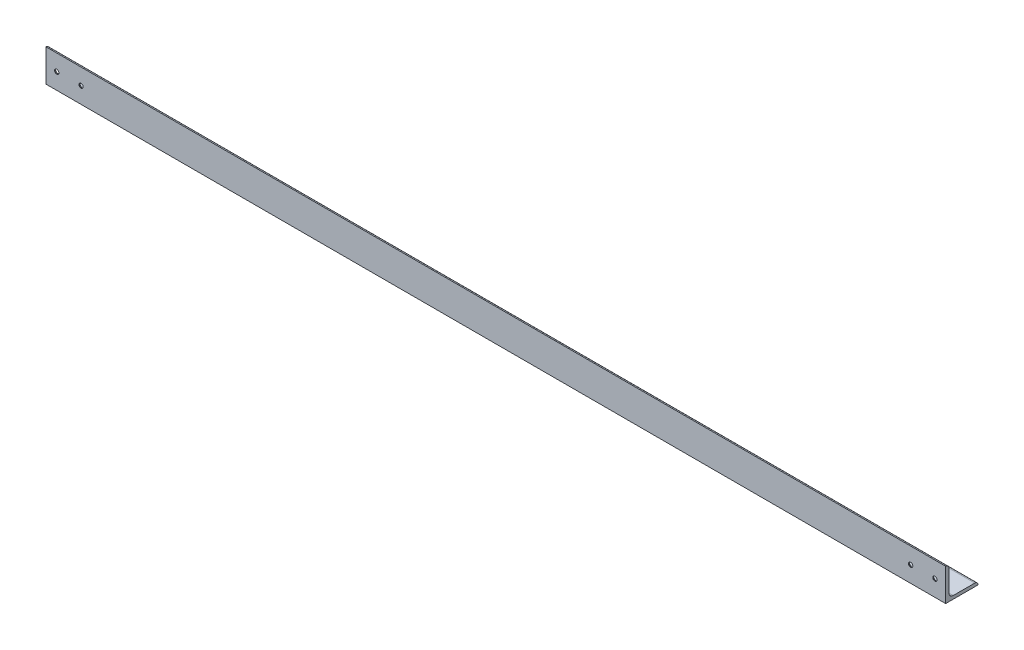
ISO-10303-21;
HEADER;
FILE_DESCRIPTION(('STEP AP214'),'2;1');
FILE_NAME('part.step','',(''),(''),'','','');
FILE_SCHEMA(('AUTOMOTIVE_DESIGN { 1 0 10303 214 1 1 1 1 }'));
ENDSEC;
DATA;
#1=APPLICATION_CONTEXT('core data for automotive mechanical design processes');
#2=APPLICATION_PROTOCOL_DEFINITION('international standard','automotive_design',2000,#1);
#3=PRODUCT_CONTEXT('',#1,'mechanical');
#4=PRODUCT('Part','Part','',(#3));
#5=PRODUCT_RELATED_PRODUCT_CATEGORY('part','',(#4));
#6=PRODUCT_DEFINITION_FORMATION('','',#4);
#7=PRODUCT_DEFINITION_CONTEXT('part definition',#1,'design');
#8=PRODUCT_DEFINITION('design','',#6,#7);
#9=PRODUCT_DEFINITION_SHAPE('','',#8);
#10=(LENGTH_UNIT() NAMED_UNIT(*) SI_UNIT(.MILLI.,.METRE.));
#11=(NAMED_UNIT(*) PLANE_ANGLE_UNIT() SI_UNIT($,.RADIAN.));
#12=(NAMED_UNIT(*) SI_UNIT($,.STERADIAN.) SOLID_ANGLE_UNIT());
#13=UNCERTAINTY_MEASURE_WITH_UNIT(LENGTH_MEASURE(1.E-05),#10,'distance_accuracy_value','');
#14=(GEOMETRIC_REPRESENTATION_CONTEXT(3) GLOBAL_UNCERTAINTY_ASSIGNED_CONTEXT((#13)) GLOBAL_UNIT_ASSIGNED_CONTEXT((#10,
#11,#12)) REPRESENTATION_CONTEXT('',''));
#15=CARTESIAN_POINT('',(0.,0.,0.));
#16=DIRECTION('',(0.,0.,1.));
#17=DIRECTION('',(1.,0.,0.));
#18=AXIS2_PLACEMENT_3D('',#15,#16,#17);
#19=CARTESIAN_POINT('',(1670.,0.,-60.));
#20=DIRECTION('',(0.,1.,0.));
#21=DIRECTION('',(0.,0.,1.));
#22=AXIS2_PLACEMENT_3D('',#19,#20,#21);
#23=PLANE('',#22);
#24=CARTESIAN_POINT('',(435.,0.,-30.0000000000001));
#25=DIRECTION('',(0.,-1.,0.));
#26=DIRECTION('',(0.,0.,-1.));
#27=AXIS2_PLACEMENT_3D('',#24,#25,#26);
#28=CIRCLE('',#27,4.);
#29=CARTESIAN_POINT('',(435.,0.,-34.0000000000001));
#30=VERTEX_POINT('',#29);
#31=EDGE_CURVE('E240',#30,#30,#28,.T.);
#32=ORIENTED_EDGE('',*,*,#31,.F.);
#33=EDGE_LOOP('',(#32));
#34=FACE_BOUND('',#33,.T.);
#35=CARTESIAN_POINT('',(1235.,0.,-30.0000000000001));
#36=DIRECTION('',(0.,-1.,0.));
#37=DIRECTION('',(0.,0.,-1.));
#38=AXIS2_PLACEMENT_3D('',#35,#36,#37);
#39=CIRCLE('',#38,4.);
#40=CARTESIAN_POINT('',(1235.,0.,-34.0000000000001));
#41=VERTEX_POINT('',#40);
#42=EDGE_CURVE('E486',#41,#41,#39,.T.);
#43=ORIENTED_EDGE('',*,*,#42,.F.);
#44=EDGE_LOOP('',(#43));
#45=FACE_BOUND('',#44,.T.);
#46=CARTESIAN_POINT('',(835.,0.,-30.0000000000001));
#47=DIRECTION('',(0.,-1.,0.));
#48=DIRECTION('',(0.,0.,-1.));
#49=AXIS2_PLACEMENT_3D('',#46,#47,#48);
#50=CIRCLE('',#49,4.);
#51=CARTESIAN_POINT('',(835.,0.,-34.0000000000001));
#52=VERTEX_POINT('',#51);
#53=EDGE_CURVE('E259',#52,#52,#50,.T.);
#54=ORIENTED_EDGE('',*,*,#53,.F.);
#55=EDGE_LOOP('',(#54));
#56=FACE_BOUND('',#55,.T.);
#57=CARTESIAN_POINT('',(1635.,0.,-30.0000000000001));
#58=DIRECTION('',(0.,-1.,0.));
#59=DIRECTION('',(0.,0.,-1.));
#60=AXIS2_PLACEMENT_3D('',#57,#58,#59);
#61=CIRCLE('',#60,4.);
#62=CARTESIAN_POINT('',(1635.,0.,-34.0000000000001));
#63=VERTEX_POINT('',#62);
#64=EDGE_CURVE('E488',#63,#63,#61,.T.);
#65=ORIENTED_EDGE('',*,*,#64,.F.);
#66=EDGE_LOOP('',(#65));
#67=FACE_BOUND('',#66,.T.);
#68=CARTESIAN_POINT('',(35.,0.,-30.0000000000001));
#69=DIRECTION('',(0.,-1.,0.));
#70=DIRECTION('',(0.,0.,-1.));
#71=AXIS2_PLACEMENT_3D('',#68,#69,#70);
#72=CIRCLE('',#71,4.);
#73=CARTESIAN_POINT('',(35.,0.,-34.0000000000001));
#74=VERTEX_POINT('',#73);
#75=EDGE_CURVE('E234',#74,#74,#72,.T.);
#76=ORIENTED_EDGE('',*,*,#75,.F.);
#77=EDGE_LOOP('',(#76));
#78=FACE_BOUND('',#77,.T.);
#79=DIRECTION('',(0.,0.,-1.));
#80=VECTOR('',#79,1.);
#81=CARTESIAN_POINT('',(0.,0.,-60.));
#82=LINE('',#81,#80);
#83=CARTESIAN_POINT('',(0.,0.,0.));
#84=VERTEX_POINT('',#83);
#85=CARTESIAN_POINT('',(0.,0.,-60.));
#86=VERTEX_POINT('',#85);
#87=EDGE_CURVE('E164',#84,#86,#82,.T.);
#88=ORIENTED_EDGE('',*,*,#87,.T.);
#89=DIRECTION('',(-1.,0.,0.));
#90=VECTOR('',#89,1.);
#91=CARTESIAN_POINT('',(1670.,0.,-60.));
#92=LINE('',#91,#90);
#93=CARTESIAN_POINT('',(1670.,0.,-60.));
#94=VERTEX_POINT('',#93);
#95=EDGE_CURVE('E199',#94,#86,#92,.T.);
#96=ORIENTED_EDGE('',*,*,#95,.F.);
#97=DIRECTION('',(0.,0.,-1.));
#98=VECTOR('',#97,1.);
#99=CARTESIAN_POINT('',(1670.,0.,-60.));
#100=LINE('',#99,#98);
#101=CARTESIAN_POINT('',(1670.,0.,0.));
#102=VERTEX_POINT('',#101);
#103=EDGE_CURVE('E184',#102,#94,#100,.T.);
#104=ORIENTED_EDGE('',*,*,#103,.F.);
#105=DIRECTION('',(-1.,0.,0.));
#106=VECTOR('',#105,1.);
#107=CARTESIAN_POINT('',(1670.,0.,0.));
#108=LINE('',#107,#106);
#109=EDGE_CURVE('E160',#102,#84,#108,.T.);
#110=ORIENTED_EDGE('',*,*,#109,.T.);
#111=EDGE_LOOP('',(#88,#96,#104,#110));
#112=FACE_BOUND('',#111,.T.);
#113=ADVANCED_FACE('F65',(#34,#45,#56,#67,#78,#112),#23,.F.);
#114=CARTESIAN_POINT('',(1670.,0.,-54.));
#115=DIRECTION('',(-1.,0.,0.));
#116=DIRECTION('',(0.,0.,1.));
#117=AXIS2_PLACEMENT_3D('',#114,#115,#116);
#118=CYLINDRICAL_SURFACE('',#117,6.);
#119=CARTESIAN_POINT('',(0.,0.,-54.));
#120=DIRECTION('',(1.,0.,0.));
#121=DIRECTION('',(0.,0.,-1.));
#122=AXIS2_PLACEMENT_3D('',#119,#120,#121);
#123=CIRCLE('',#122,6.);
#124=CARTESIAN_POINT('',(0.,6.,-54.));
#125=VERTEX_POINT('',#124);
#126=EDGE_CURVE('E168',#86,#125,#123,.T.);
#127=ORIENTED_EDGE('',*,*,#126,.T.);
#128=DIRECTION('',(-1.,0.,0.));
#129=VECTOR('',#128,1.);
#130=CARTESIAN_POINT('',(1670.,6.,-54.));
#131=LINE('',#130,#129);
#132=CARTESIAN_POINT('',(1670.,6.,-54.));
#133=VERTEX_POINT('',#132);
#134=EDGE_CURVE('E195',#133,#125,#131,.T.);
#135=ORIENTED_EDGE('',*,*,#134,.F.);
#136=CARTESIAN_POINT('',(1670.,0.,-54.));
#137=DIRECTION('',(1.,0.,0.));
#138=DIRECTION('',(0.,0.,-1.));
#139=AXIS2_PLACEMENT_3D('',#136,#137,#138);
#140=CIRCLE('',#139,6.);
#141=EDGE_CURVE('E126',#94,#133,#140,.T.);
#142=ORIENTED_EDGE('',*,*,#141,.F.);
#143=ORIENTED_EDGE('',*,*,#95,.T.);
#144=EDGE_LOOP('',(#127,#135,#142,#143));
#145=FACE_BOUND('',#144,.T.);
#146=ADVANCED_FACE('F310',(#145),#118,.T.);
#147=CARTESIAN_POINT('',(1670.,6.,-14.));
#148=DIRECTION('',(0.,-1.,0.));
#149=DIRECTION('',(0.,0.,-1.));
#150=AXIS2_PLACEMENT_3D('',#147,#148,#149);
#151=PLANE('',#150);
#152=CARTESIAN_POINT('',(435.,6.,-30.0000000000001));
#153=DIRECTION('',(0.,-1.,0.));
#154=DIRECTION('',(0.,0.,-1.));
#155=AXIS2_PLACEMENT_3D('',#152,#153,#154);
#156=CIRCLE('',#155,4.);
#157=CARTESIAN_POINT('',(435.,6.,-34.0000000000001));
#158=VERTEX_POINT('',#157);
#159=EDGE_CURVE('E69',#158,#158,#156,.T.);
#160=ORIENTED_EDGE('',*,*,#159,.T.);
#161=EDGE_LOOP('',(#160));
#162=FACE_BOUND('',#161,.T.);
#163=CARTESIAN_POINT('',(1235.,6.,-30.0000000000001));
#164=DIRECTION('',(0.,-1.,0.));
#165=DIRECTION('',(0.,0.,-1.));
#166=AXIS2_PLACEMENT_3D('',#163,#164,#165);
#167=CIRCLE('',#166,4.);
#168=CARTESIAN_POINT('',(1235.,6.,-34.0000000000001));
#169=VERTEX_POINT('',#168);
#170=EDGE_CURVE('E243',#169,#169,#167,.T.);
#171=ORIENTED_EDGE('',*,*,#170,.T.);
#172=EDGE_LOOP('',(#171));
#173=FACE_BOUND('',#172,.T.);
#174=CARTESIAN_POINT('',(835.,6.,-30.0000000000001));
#175=DIRECTION('',(0.,-1.,0.));
#176=DIRECTION('',(0.,0.,-1.));
#177=AXIS2_PLACEMENT_3D('',#174,#175,#176);
#178=CIRCLE('',#177,4.);
#179=CARTESIAN_POINT('',(835.,6.,-34.0000000000001));
#180=VERTEX_POINT('',#179);
#181=EDGE_CURVE('E239',#180,#180,#178,.T.);
#182=ORIENTED_EDGE('',*,*,#181,.T.);
#183=EDGE_LOOP('',(#182));
#184=FACE_BOUND('',#183,.T.);
#185=CARTESIAN_POINT('',(1635.,6.,-30.0000000000001));
#186=DIRECTION('',(0.,-1.,0.));
#187=DIRECTION('',(0.,0.,-1.));
#188=AXIS2_PLACEMENT_3D('',#185,#186,#187);
#189=CIRCLE('',#188,4.);
#190=CARTESIAN_POINT('',(1635.,6.,-34.0000000000001));
#191=VERTEX_POINT('',#190);
#192=EDGE_CURVE('E235',#191,#191,#189,.T.);
#193=ORIENTED_EDGE('',*,*,#192,.T.);
#194=EDGE_LOOP('',(#193));
#195=FACE_BOUND('',#194,.T.);
#196=CARTESIAN_POINT('',(35.,6.,-30.0000000000001));
#197=DIRECTION('',(0.,-1.,0.));
#198=DIRECTION('',(0.,0.,-1.));
#199=AXIS2_PLACEMENT_3D('',#196,#197,#198);
#200=CIRCLE('',#199,4.);
#201=CARTESIAN_POINT('',(35.,6.,-34.0000000000001));
#202=VERTEX_POINT('',#201);
#203=EDGE_CURVE('E229',#202,#202,#200,.T.);
#204=ORIENTED_EDGE('',*,*,#203,.T.);
#205=EDGE_LOOP('',(#204));
#206=FACE_BOUND('',#205,.T.);
#207=DIRECTION('',(0.,0.,1.));
#208=VECTOR('',#207,1.);
#209=CARTESIAN_POINT('',(0.,6.,-14.));
#210=LINE('',#209,#208);
#211=CARTESIAN_POINT('',(0.,6.,-14.));
#212=VERTEX_POINT('',#211);
#213=EDGE_CURVE('E172',#125,#212,#210,.T.);
#214=ORIENTED_EDGE('',*,*,#213,.T.);
#215=DIRECTION('',(-1.,0.,0.));
#216=VECTOR('',#215,1.);
#217=CARTESIAN_POINT('',(1670.,6.,-14.));
#218=LINE('',#217,#216);
#219=CARTESIAN_POINT('',(1670.,6.,-14.));
#220=VERTEX_POINT('',#219);
#221=EDGE_CURVE('E191',#220,#212,#218,.T.);
#222=ORIENTED_EDGE('',*,*,#221,.F.);
#223=DIRECTION('',(0.,0.,1.));
#224=VECTOR('',#223,1.);
#225=CARTESIAN_POINT('',(1670.,6.,-14.));
#226=LINE('',#225,#224);
#227=EDGE_CURVE('E279',#133,#220,#226,.T.);
#228=ORIENTED_EDGE('',*,*,#227,.F.);
#229=ORIENTED_EDGE('',*,*,#134,.T.);
#230=EDGE_LOOP('',(#214,#222,#228,#229));
#231=FACE_BOUND('',#230,.T.);
#232=ADVANCED_FACE('F285',(#162,#173,#184,#195,#206,#231),#151,.F.);
#233=CARTESIAN_POINT('',(1670.,14.,-14.));
#234=DIRECTION('',(-1.,0.,0.));
#235=DIRECTION('',(0.,0.,1.));
#236=AXIS2_PLACEMENT_3D('',#233,#234,#235);
#237=CYLINDRICAL_SURFACE('',#236,8.);
#238=CARTESIAN_POINT('',(0.,14.,-14.));
#239=DIRECTION('',(-1.,0.,0.));
#240=DIRECTION('',(0.,0.,1.));
#241=AXIS2_PLACEMENT_3D('',#238,#239,#240);
#242=CIRCLE('',#241,8.);
#243=CARTESIAN_POINT('',(0.,14.,-6.));
#244=VERTEX_POINT('',#243);
#245=EDGE_CURVE('E175',#212,#244,#242,.T.);
#246=ORIENTED_EDGE('',*,*,#245,.T.);
#247=DIRECTION('',(-1.,0.,0.));
#248=VECTOR('',#247,1.);
#249=CARTESIAN_POINT('',(1670.,14.,-6.));
#250=LINE('',#249,#248);
#251=CARTESIAN_POINT('',(1670.,14.,-6.));
#252=VERTEX_POINT('',#251);
#253=EDGE_CURVE('E153',#252,#244,#250,.T.);
#254=ORIENTED_EDGE('',*,*,#253,.F.);
#255=CARTESIAN_POINT('',(1670.,14.,-14.));
#256=DIRECTION('',(-1.,0.,0.));
#257=DIRECTION('',(0.,0.,1.));
#258=AXIS2_PLACEMENT_3D('',#255,#256,#257);
#259=CIRCLE('',#258,8.);
#260=EDGE_CURVE('E142',#220,#252,#259,.T.);
#261=ORIENTED_EDGE('',*,*,#260,.F.);
#262=ORIENTED_EDGE('',*,*,#221,.T.);
#263=EDGE_LOOP('',(#246,#254,#261,#262));
#264=FACE_BOUND('',#263,.T.);
#265=ADVANCED_FACE('F289',(#264),#237,.F.);
#266=CARTESIAN_POINT('',(1670.,54.,-6.));
#267=DIRECTION('',(0.,0.,1.));
#268=DIRECTION('',(1.,0.,0.));
#269=AXIS2_PLACEMENT_3D('',#266,#267,#268);
#270=PLANE('',#269);
#271=CARTESIAN_POINT('',(1650.,30.0000000000001,-6.));
#272=DIRECTION('',(0.,0.,1.));
#273=DIRECTION('',(1.,0.,0.));
#274=AXIS2_PLACEMENT_3D('',#271,#272,#273);
#275=CIRCLE('',#274,9.49999999999984);
#276=CARTESIAN_POINT('',(1659.5,30.0000000000001,-6.));
#277=VERTEX_POINT('',#276);
#278=EDGE_CURVE('E214',#277,#277,#275,.T.);
#279=ORIENTED_EDGE('',*,*,#278,.T.);
#280=EDGE_LOOP('',(#279));
#281=FACE_BOUND('',#280,.T.);
#282=CARTESIAN_POINT('',(20.,29.9999999999997,-6.));
#283=DIRECTION('',(0.,0.,1.));
#284=DIRECTION('',(1.,0.,0.));
#285=AXIS2_PLACEMENT_3D('',#282,#283,#284);
#286=CIRCLE('',#285,9.50000000000006);
#287=CARTESIAN_POINT('',(29.5000000000001,29.9999999999997,-6.));
#288=VERTEX_POINT('',#287);
#289=EDGE_CURVE('E210',#288,#288,#286,.T.);
#290=ORIENTED_EDGE('',*,*,#289,.T.);
#291=EDGE_LOOP('',(#290));
#292=FACE_BOUND('',#291,.T.);
#293=CARTESIAN_POINT('',(64.9999999999999,30.,-6.));
#294=DIRECTION('',(0.,0.,1.));
#295=DIRECTION('',(1.,0.,0.));
#296=AXIS2_PLACEMENT_3D('',#293,#294,#295);
#297=CIRCLE('',#296,9.50000000000006);
#298=CARTESIAN_POINT('',(74.5,30.,-6.));
#299=VERTEX_POINT('',#298);
#300=EDGE_CURVE('E206',#299,#299,#297,.T.);
#301=ORIENTED_EDGE('',*,*,#300,.T.);
#302=EDGE_LOOP('',(#301));
#303=FACE_BOUND('',#302,.T.);
#304=CARTESIAN_POINT('',(1605.,30.0000000000001,-6.));
#305=DIRECTION('',(0.,0.,1.));
#306=DIRECTION('',(1.,0.,0.));
#307=AXIS2_PLACEMENT_3D('',#304,#305,#306);
#308=CIRCLE('',#307,9.49999999999984);
#309=CARTESIAN_POINT('',(1614.5,30.0000000000001,-6.));
#310=VERTEX_POINT('',#309);
#311=EDGE_CURVE('E202',#310,#310,#308,.T.);
#312=ORIENTED_EDGE('',*,*,#311,.T.);
#313=EDGE_LOOP('',(#312));
#314=FACE_BOUND('',#313,.T.);
#315=DIRECTION('',(0.,1.,0.));
#316=VECTOR('',#315,1.);
#317=CARTESIAN_POINT('',(0.,54.,-6.));
#318=LINE('',#317,#316);
#319=CARTESIAN_POINT('',(0.,54.,-6.));
#320=VERTEX_POINT('',#319);
#321=EDGE_CURVE('E151',#244,#320,#318,.T.);
#322=ORIENTED_EDGE('',*,*,#321,.T.);
#323=DIRECTION('',(-1.,0.,0.));
#324=VECTOR('',#323,1.);
#325=CARTESIAN_POINT('',(1670.,54.,-6.));
#326=LINE('',#325,#324);
#327=CARTESIAN_POINT('',(1670.,54.,-6.));
#328=VERTEX_POINT('',#327);
#329=EDGE_CURVE('E148',#328,#320,#326,.T.);
#330=ORIENTED_EDGE('',*,*,#329,.F.);
#331=DIRECTION('',(0.,1.,0.));
#332=VECTOR('',#331,1.);
#333=CARTESIAN_POINT('',(1670.,54.,-6.));
#334=LINE('',#333,#332);
#335=EDGE_CURVE('E136',#252,#328,#334,.T.);
#336=ORIENTED_EDGE('',*,*,#335,.F.);
#337=ORIENTED_EDGE('',*,*,#253,.T.);
#338=EDGE_LOOP('',(#322,#330,#336,#337));
#339=FACE_BOUND('',#338,.T.);
#340=ADVANCED_FACE('F149',(#281,#292,#303,#314,#339),#270,.F.);
#341=CARTESIAN_POINT('',(1670.,54.,0.));
#342=DIRECTION('',(-1.,0.,0.));
#343=DIRECTION('',(0.,0.,1.));
#344=AXIS2_PLACEMENT_3D('',#341,#342,#343);
#345=CYLINDRICAL_SURFACE('',#344,6.);
#346=CARTESIAN_POINT('',(0.,54.,0.));
#347=DIRECTION('',(1.,0.,0.));
#348=DIRECTION('',(0.,0.,-1.));
#349=AXIS2_PLACEMENT_3D('',#346,#347,#348);
#350=CIRCLE('',#349,6.);
#351=CARTESIAN_POINT('',(0.,60.,0.));
#352=VERTEX_POINT('',#351);
#353=EDGE_CURVE('E111',#320,#352,#350,.T.);
#354=ORIENTED_EDGE('',*,*,#353,.T.);
#355=DIRECTION('',(-1.,0.,0.));
#356=VECTOR('',#355,1.);
#357=CARTESIAN_POINT('',(1670.,60.,0.));
#358=LINE('',#357,#356);
#359=CARTESIAN_POINT('',(1670.,60.,0.));
#360=VERTEX_POINT('',#359);
#361=EDGE_CURVE('E154',#360,#352,#358,.T.);
#362=ORIENTED_EDGE('',*,*,#361,.F.);
#363=CARTESIAN_POINT('',(1670.,54.,0.));
#364=DIRECTION('',(1.,0.,0.));
#365=DIRECTION('',(0.,0.,-1.));
#366=AXIS2_PLACEMENT_3D('',#363,#364,#365);
#367=CIRCLE('',#366,6.);
#368=EDGE_CURVE('E140',#328,#360,#367,.T.);
#369=ORIENTED_EDGE('',*,*,#368,.F.);
#370=ORIENTED_EDGE('',*,*,#329,.T.);
#371=EDGE_LOOP('',(#354,#362,#369,#370));
#372=FACE_BOUND('',#371,.T.);
#373=ADVANCED_FACE('F156',(#372),#345,.T.);
#374=CARTESIAN_POINT('',(1670.,60.,0.));
#375=DIRECTION('',(0.,0.,-1.));
#376=DIRECTION('',(-1.,0.,0.));
#377=AXIS2_PLACEMENT_3D('',#374,#375,#376);
#378=PLANE('',#377);
#379=CARTESIAN_POINT('',(20.,29.9999999999997,0.));
#380=DIRECTION('',(0.,0.,1.));
#381=DIRECTION('',(1.,0.,0.));
#382=AXIS2_PLACEMENT_3D('',#379,#380,#381);
#383=CIRCLE('',#382,3.99999999999999);
#384=CARTESIAN_POINT('',(24.,29.9999999999997,0.));
#385=VERTEX_POINT('',#384);
#386=EDGE_CURVE('E233',#385,#385,#383,.T.);
#387=ORIENTED_EDGE('',*,*,#386,.F.);
#388=EDGE_LOOP('',(#387));
#389=FACE_BOUND('',#388,.T.);
#390=CARTESIAN_POINT('',(1650.,30.0000000000001,0.));
#391=DIRECTION('',(0.,0.,1.));
#392=DIRECTION('',(1.,0.,0.));
#393=AXIS2_PLACEMENT_3D('',#390,#391,#392);
#394=CIRCLE('',#393,3.99999999999999);
#395=CARTESIAN_POINT('',(1654.,30.0000000000001,0.));
#396=VERTEX_POINT('',#395);
#397=EDGE_CURVE('E265',#396,#396,#394,.T.);
#398=ORIENTED_EDGE('',*,*,#397,.F.);
#399=EDGE_LOOP('',(#398));
#400=FACE_BOUND('',#399,.T.);
#401=CARTESIAN_POINT('',(1605.,30.0000000000001,0.));
#402=DIRECTION('',(0.,0.,1.));
#403=DIRECTION('',(1.,0.,0.));
#404=AXIS2_PLACEMENT_3D('',#401,#402,#403);
#405=CIRCLE('',#404,3.99999999999999);
#406=CARTESIAN_POINT('',(1609.,30.0000000000001,0.));
#407=VERTEX_POINT('',#406);
#408=EDGE_CURVE('E261',#407,#407,#405,.T.);
#409=ORIENTED_EDGE('',*,*,#408,.F.);
#410=EDGE_LOOP('',(#409));
#411=FACE_BOUND('',#410,.T.);
#412=CARTESIAN_POINT('',(64.9999999999999,30.,0.));
#413=DIRECTION('',(0.,0.,1.));
#414=DIRECTION('',(1.,0.,0.));
#415=AXIS2_PLACEMENT_3D('',#412,#413,#414);
#416=CIRCLE('',#415,3.99999999999999);
#417=CARTESIAN_POINT('',(68.9999999999999,30.,0.));
#418=VERTEX_POINT('',#417);
#419=EDGE_CURVE('E169',#418,#418,#416,.T.);
#420=ORIENTED_EDGE('',*,*,#419,.F.);
#421=EDGE_LOOP('',(#420));
#422=FACE_BOUND('',#421,.T.);
#423=DIRECTION('',(0.,-1.,0.));
#424=VECTOR('',#423,1.);
#425=CARTESIAN_POINT('',(0.,60.,0.));
#426=LINE('',#425,#424);
#427=EDGE_CURVE('E117',#352,#84,#426,.T.);
#428=ORIENTED_EDGE('',*,*,#427,.T.);
#429=ORIENTED_EDGE('',*,*,#109,.F.);
#430=DIRECTION('',(0.,-1.,0.));
#431=VECTOR('',#430,1.);
#432=CARTESIAN_POINT('',(1670.,60.,0.));
#433=LINE('',#432,#431);
#434=EDGE_CURVE('E85',#360,#102,#433,.T.);
#435=ORIENTED_EDGE('',*,*,#434,.F.);
#436=ORIENTED_EDGE('',*,*,#361,.T.);
#437=EDGE_LOOP('',(#428,#429,#435,#436));
#438=FACE_BOUND('',#437,.T.);
#439=ADVANCED_FACE('F296',(#389,#400,#411,#422,#438),#378,.F.);
#440=CARTESIAN_POINT('',(1670.,54.,0.));
#441=DIRECTION('',(1.,0.,0.));
#442=DIRECTION('',(0.,0.,-1.));
#443=AXIS2_PLACEMENT_3D('',#440,#441,#442);
#444=PLANE('',#443);
#445=ORIENTED_EDGE('',*,*,#103,.T.);
#446=ORIENTED_EDGE('',*,*,#141,.T.);
#447=ORIENTED_EDGE('',*,*,#227,.T.);
#448=ORIENTED_EDGE('',*,*,#260,.T.);
#449=ORIENTED_EDGE('',*,*,#335,.T.);
#450=ORIENTED_EDGE('',*,*,#368,.T.);
#451=ORIENTED_EDGE('',*,*,#434,.T.);
#452=EDGE_LOOP('',(#445,#446,#447,#448,#449,#450,#451));
#453=FACE_BOUND('',#452,.T.);
#454=ADVANCED_FACE('F138',(#453),#444,.T.);
#455=CARTESIAN_POINT('',(0.,54.,0.));
#456=DIRECTION('',(1.,0.,0.));
#457=DIRECTION('',(0.,0.,-1.));
#458=AXIS2_PLACEMENT_3D('',#455,#456,#457);
#459=PLANE('',#458);
#460=ORIENTED_EDGE('',*,*,#87,.F.);
#461=ORIENTED_EDGE('',*,*,#427,.F.);
#462=ORIENTED_EDGE('',*,*,#353,.F.);
#463=ORIENTED_EDGE('',*,*,#321,.F.);
#464=ORIENTED_EDGE('',*,*,#245,.F.);
#465=ORIENTED_EDGE('',*,*,#213,.F.);
#466=ORIENTED_EDGE('',*,*,#126,.F.);
#467=EDGE_LOOP('',(#460,#461,#462,#463,#464,#465,#466));
#468=FACE_BOUND('',#467,.T.);
#469=ADVANCED_FACE('F292',(#468),#459,.F.);
#470=CARTESIAN_POINT('',(64.9999999999999,30.,-60.));
#471=DIRECTION('',(0.,0.,1.));
#472=DIRECTION('',(1.,0.,0.));
#473=AXIS2_PLACEMENT_3D('',#470,#471,#472);
#474=CYLINDRICAL_SURFACE('',#473,3.99999999999999);
#475=CARTESIAN_POINT('',(64.9999999999999,30.,-0.499999999999945));
#476=DIRECTION('',(0.,0.,1.));
#477=DIRECTION('',(1.,0.,0.));
#478=AXIS2_PLACEMENT_3D('',#475,#476,#477);
#479=CIRCLE('',#478,3.99999999999999);
#480=CARTESIAN_POINT('',(68.9999999999999,30.,-0.499999999999945));
#481=VERTEX_POINT('',#480);
#482=EDGE_CURVE('E76',#481,#481,#479,.F.);
#483=ORIENTED_EDGE('',*,*,#482,.T.);
#484=EDGE_LOOP('',(#483));
#485=FACE_BOUND('',#484,.T.);
#486=ORIENTED_EDGE('',*,*,#419,.T.);
#487=EDGE_LOOP('',(#486));
#488=FACE_BOUND('',#487,.T.);
#489=ADVANCED_FACE('F378',(#485,#488),#474,.F.);
#490=CARTESIAN_POINT('',(1605.,30.0000000000001,-60.));
#491=DIRECTION('',(0.,0.,1.));
#492=DIRECTION('',(1.,0.,0.));
#493=AXIS2_PLACEMENT_3D('',#490,#491,#492);
#494=CYLINDRICAL_SURFACE('',#493,3.99999999999999);
#495=CARTESIAN_POINT('',(1605.,30.0000000000001,-0.500000000000132));
#496=DIRECTION('',(0.,0.,1.));
#497=DIRECTION('',(1.,0.,0.));
#498=AXIS2_PLACEMENT_3D('',#495,#496,#497);
#499=CIRCLE('',#498,3.99999999999999);
#500=CARTESIAN_POINT('',(1609.,30.0000000000001,-0.500000000000132));
#501=VERTEX_POINT('',#500);
#502=EDGE_CURVE('E13',#501,#501,#499,.F.);
#503=ORIENTED_EDGE('',*,*,#502,.T.);
#504=EDGE_LOOP('',(#503));
#505=FACE_BOUND('',#504,.T.);
#506=ORIENTED_EDGE('',*,*,#408,.T.);
#507=EDGE_LOOP('',(#506));
#508=FACE_BOUND('',#507,.T.);
#509=ADVANCED_FACE('F374',(#505,#508),#494,.F.);
#510=CARTESIAN_POINT('',(1650.,30.0000000000001,-60.));
#511=DIRECTION('',(0.,0.,1.));
#512=DIRECTION('',(1.,0.,0.));
#513=AXIS2_PLACEMENT_3D('',#510,#511,#512);
#514=CYLINDRICAL_SURFACE('',#513,3.99999999999999);
#515=CARTESIAN_POINT('',(1650.,30.0000000000001,-0.500000000000132));
#516=DIRECTION('',(0.,0.,1.));
#517=DIRECTION('',(1.,0.,0.));
#518=AXIS2_PLACEMENT_3D('',#515,#516,#517);
#519=CIRCLE('',#518,3.99999999999999);
#520=CARTESIAN_POINT('',(1654.,30.0000000000001,-0.500000000000132));
#521=VERTEX_POINT('',#520);
#522=EDGE_CURVE('E218',#521,#521,#519,.F.);
#523=ORIENTED_EDGE('',*,*,#522,.T.);
#524=EDGE_LOOP('',(#523));
#525=FACE_BOUND('',#524,.T.);
#526=ORIENTED_EDGE('',*,*,#397,.T.);
#527=EDGE_LOOP('',(#526));
#528=FACE_BOUND('',#527,.T.);
#529=ADVANCED_FACE('F377',(#525,#528),#514,.F.);
#530=CARTESIAN_POINT('',(20.,29.9999999999997,-60.));
#531=DIRECTION('',(0.,0.,1.));
#532=DIRECTION('',(1.,0.,0.));
#533=AXIS2_PLACEMENT_3D('',#530,#531,#532);
#534=CYLINDRICAL_SURFACE('',#533,3.99999999999999);
#535=CARTESIAN_POINT('',(20.,29.9999999999997,-0.499999999999945));
#536=DIRECTION('',(0.,0.,1.));
#537=DIRECTION('',(1.,0.,0.));
#538=AXIS2_PLACEMENT_3D('',#535,#536,#537);
#539=CIRCLE('',#538,3.99999999999999);
#540=CARTESIAN_POINT('',(24.,29.9999999999997,-0.499999999999945));
#541=VERTEX_POINT('',#540);
#542=EDGE_CURVE('E222',#541,#541,#539,.F.);
#543=ORIENTED_EDGE('',*,*,#542,.T.);
#544=EDGE_LOOP('',(#543));
#545=FACE_BOUND('',#544,.T.);
#546=ORIENTED_EDGE('',*,*,#386,.T.);
#547=EDGE_LOOP('',(#546));
#548=FACE_BOUND('',#547,.T.);
#549=ADVANCED_FACE('F325',(#545,#548),#534,.F.);
#550=CARTESIAN_POINT('',(1650.,30.0000000000001,-6.));
#551=DIRECTION('',(0.,0.,-1.));
#552=DIRECTION('',(-1.,0.,0.));
#553=AXIS2_PLACEMENT_3D('',#550,#551,#552);
#554=CONICAL_SURFACE('',#553,9.49999999999984,0.785398163397447);
#555=ORIENTED_EDGE('',*,*,#522,.F.);
#556=EDGE_LOOP('',(#555));
#557=FACE_BOUND('',#556,.T.);
#558=ORIENTED_EDGE('',*,*,#278,.F.);
#559=EDGE_LOOP('',(#558));
#560=FACE_BOUND('',#559,.T.);
#561=ADVANCED_FACE('F321',(#557,#560),#554,.F.);
#562=CARTESIAN_POINT('',(20.,29.9999999999997,-6.));
#563=DIRECTION('',(0.,0.,-1.));
#564=DIRECTION('',(-1.,0.,0.));
#565=AXIS2_PLACEMENT_3D('',#562,#563,#564);
#566=CONICAL_SURFACE('',#565,9.50000000000007,0.78539816339745);
#567=ORIENTED_EDGE('',*,*,#542,.F.);
#568=EDGE_LOOP('',(#567));
#569=FACE_BOUND('',#568,.T.);
#570=ORIENTED_EDGE('',*,*,#289,.F.);
#571=EDGE_LOOP('',(#570));
#572=FACE_BOUND('',#571,.T.);
#573=ADVANCED_FACE('F324',(#569,#572),#566,.F.);
#574=CARTESIAN_POINT('',(64.9999999999999,30.,-6.));
#575=DIRECTION('',(0.,0.,-1.));
#576=DIRECTION('',(-1.,0.,0.));
#577=AXIS2_PLACEMENT_3D('',#574,#575,#576);
#578=CONICAL_SURFACE('',#577,9.50000000000006,0.78539816339745);
#579=ORIENTED_EDGE('',*,*,#482,.F.);
#580=EDGE_LOOP('',(#579));
#581=FACE_BOUND('',#580,.T.);
#582=ORIENTED_EDGE('',*,*,#300,.F.);
#583=EDGE_LOOP('',(#582));
#584=FACE_BOUND('',#583,.T.);
#585=ADVANCED_FACE('F328',(#581,#584),#578,.F.);
#586=CARTESIAN_POINT('',(1605.,30.0000000000001,-6.));
#587=DIRECTION('',(0.,0.,-1.));
#588=DIRECTION('',(-1.,0.,0.));
#589=AXIS2_PLACEMENT_3D('',#586,#587,#588);
#590=CONICAL_SURFACE('',#589,9.49999999999984,0.785398163397447);
#591=ORIENTED_EDGE('',*,*,#502,.F.);
#592=EDGE_LOOP('',(#591));
#593=FACE_BOUND('',#592,.T.);
#594=ORIENTED_EDGE('',*,*,#311,.F.);
#595=EDGE_LOOP('',(#594));
#596=FACE_BOUND('',#595,.T.);
#597=ADVANCED_FACE('F67',(#593,#596),#590,.F.);
#598=CARTESIAN_POINT('',(35.,60.,-30.0000000000001));
#599=DIRECTION('',(0.,-1.,0.));
#600=DIRECTION('',(0.,0.,-1.));
#601=AXIS2_PLACEMENT_3D('',#598,#599,#600);
#602=CYLINDRICAL_SURFACE('',#601,4.);
#603=ORIENTED_EDGE('',*,*,#75,.T.);
#604=EDGE_LOOP('',(#603));
#605=FACE_BOUND('',#604,.T.);
#606=ORIENTED_EDGE('',*,*,#203,.F.);
#607=EDGE_LOOP('',(#606));
#608=FACE_BOUND('',#607,.T.);
#609=ADVANCED_FACE('F335',(#605,#608),#602,.F.);
#610=CARTESIAN_POINT('',(1635.,60.,-30.0000000000001));
#611=DIRECTION('',(0.,-1.,0.));
#612=DIRECTION('',(0.,0.,-1.));
#613=AXIS2_PLACEMENT_3D('',#610,#611,#612);
#614=CYLINDRICAL_SURFACE('',#613,4.);
#615=ORIENTED_EDGE('',*,*,#64,.T.);
#616=EDGE_LOOP('',(#615));
#617=FACE_BOUND('',#616,.T.);
#618=ORIENTED_EDGE('',*,*,#192,.F.);
#619=EDGE_LOOP('',(#618));
#620=FACE_BOUND('',#619,.T.);
#621=ADVANCED_FACE('F363',(#617,#620),#614,.F.);
#622=CARTESIAN_POINT('',(835.,60.,-30.0000000000001));
#623=DIRECTION('',(0.,-1.,0.));
#624=DIRECTION('',(0.,0.,-1.));
#625=AXIS2_PLACEMENT_3D('',#622,#623,#624);
#626=CYLINDRICAL_SURFACE('',#625,4.);
#627=ORIENTED_EDGE('',*,*,#53,.T.);
#628=EDGE_LOOP('',(#627));
#629=FACE_BOUND('',#628,.T.);
#630=ORIENTED_EDGE('',*,*,#181,.F.);
#631=EDGE_LOOP('',(#630));
#632=FACE_BOUND('',#631,.T.);
#633=ADVANCED_FACE('F368',(#629,#632),#626,.F.);
#634=CARTESIAN_POINT('',(1235.,60.,-30.0000000000001));
#635=DIRECTION('',(0.,-1.,0.));
#636=DIRECTION('',(0.,0.,-1.));
#637=AXIS2_PLACEMENT_3D('',#634,#635,#636);
#638=CYLINDRICAL_SURFACE('',#637,4.);
#639=ORIENTED_EDGE('',*,*,#42,.T.);
#640=EDGE_LOOP('',(#639));
#641=FACE_BOUND('',#640,.T.);
#642=ORIENTED_EDGE('',*,*,#170,.F.);
#643=EDGE_LOOP('',(#642));
#644=FACE_BOUND('',#643,.T.);
#645=ADVANCED_FACE('F458',(#641,#644),#638,.F.);
#646=CARTESIAN_POINT('',(435.,60.,-30.0000000000001));
#647=DIRECTION('',(0.,-1.,0.));
#648=DIRECTION('',(0.,0.,-1.));
#649=AXIS2_PLACEMENT_3D('',#646,#647,#648);
#650=CYLINDRICAL_SURFACE('',#649,4.);
#651=ORIENTED_EDGE('',*,*,#31,.T.);
#652=EDGE_LOOP('',(#651));
#653=FACE_BOUND('',#652,.T.);
#654=ORIENTED_EDGE('',*,*,#159,.F.);
#655=EDGE_LOOP('',(#654));
#656=FACE_BOUND('',#655,.T.);
#657=ADVANCED_FACE('F467',(#653,#656),#650,.F.);
#658=CLOSED_SHELL('',(#113,#146,#232,#265,#340,#373,#439,#454,#469,#489,#509,#529,#549,#561,
#573,#585,#597,#609,#621,#633,#645,#657));
#659=MANIFOLD_SOLID_BREP('B2',#658);
#660=ADVANCED_BREP_SHAPE_REPRESENTATION('',(#18,#659),#14);
#661=SHAPE_DEFINITION_REPRESENTATION(#9,#660);
ENDSEC;
END-ISO-10303-21;
